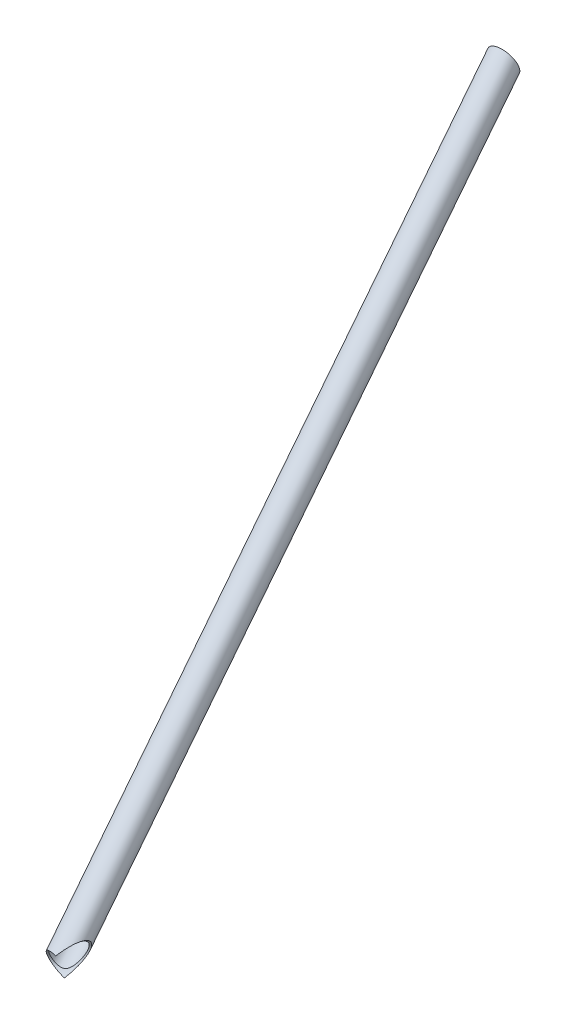
ISO-10303-21;
HEADER;
FILE_DESCRIPTION(('STEP AP214'),'2;1');
FILE_NAME('part.step','',(''),(''),'','','');
FILE_SCHEMA(('AUTOMOTIVE_DESIGN { 1 0 10303 214 1 1 1 1 }'));
ENDSEC;
DATA;
#1=APPLICATION_CONTEXT('core data for automotive mechanical design processes');
#2=APPLICATION_PROTOCOL_DEFINITION('international standard','automotive_design',2000,#1);
#3=PRODUCT_CONTEXT('',#1,'mechanical');
#4=PRODUCT('Part','Part','',(#3));
#5=PRODUCT_RELATED_PRODUCT_CATEGORY('part','',(#4));
#6=PRODUCT_DEFINITION_FORMATION('','',#4);
#7=PRODUCT_DEFINITION_CONTEXT('part definition',#1,'design');
#8=PRODUCT_DEFINITION('design','',#6,#7);
#9=PRODUCT_DEFINITION_SHAPE('','',#8);
#10=(LENGTH_UNIT() NAMED_UNIT(*) SI_UNIT(.MILLI.,.METRE.));
#11=(NAMED_UNIT(*) PLANE_ANGLE_UNIT() SI_UNIT($,.RADIAN.));
#12=(NAMED_UNIT(*) SI_UNIT($,.STERADIAN.) SOLID_ANGLE_UNIT());
#13=UNCERTAINTY_MEASURE_WITH_UNIT(LENGTH_MEASURE(1.E-05),#10,'distance_accuracy_value','');
#14=(GEOMETRIC_REPRESENTATION_CONTEXT(3) GLOBAL_UNCERTAINTY_ASSIGNED_CONTEXT((#13)) GLOBAL_UNIT_ASSIGNED_CONTEXT((#10,
#11,#12)) REPRESENTATION_CONTEXT('',''));
#15=CARTESIAN_POINT('',(0.,0.,0.));
#16=DIRECTION('',(0.,0.,1.));
#17=DIRECTION('',(1.,0.,0.));
#18=AXIS2_PLACEMENT_3D('',#15,#16,#17);
#19=CARTESIAN_POINT('',(79.9999999999999,380.,-601.037933611912));
#20=DIRECTION('',(0.313257210262409,-0.388871019636094,0.866400167535647));
#21=DIRECTION('',(0.,-0.912318699307092,-0.409480879766828));
#22=AXIS2_PLACEMENT_3D('',#19,#20,#21);
#23=CYLINDRICAL_SURFACE('',#22,7.1);
#24=CARTESIAN_POINT('',(80.,380.,-601.037933611912));
#25=DIRECTION('',(-0.0966021654991003,0.31145037677638,-0.945339454601751));
#26=DIRECTION('',(0.909209641489906,-0.358833563956318,-0.211131004829238));
#27=AXIS2_PLACEMENT_3D('',#24,#25,#26);
#28=ELLIPSE('',#27,7.31643769653913,7.1);
#29=CARTESIAN_POINT('',(86.6521756950536,377.374616585886,-602.582660454553));
#30=VERTEX_POINT('',#29);
#31=EDGE_CURVE('E82',#30,#30,#28,.T.);
#32=ORIENTED_EDGE('',*,*,#31,.T.);
#33=EDGE_LOOP('',(#32));
#34=FACE_BOUND('',#33,.T.);
#35=CARTESIAN_POINT('',(223.515440713806,195.365438417781,-207.013276925377));
#36=CARTESIAN_POINT('',(223.597773425152,195.416950629933,-207.128048578151));
#37=CARTESIAN_POINT('',(223.676056508917,195.47221110258,-207.244051635269));
#38=CARTESIAN_POINT('',(223.825780140405,195.588860752495,-207.477421559565));
#39=CARTESIAN_POINT('',(223.897216805009,195.650253367923,-207.594789158859));
#40=CARTESIAN_POINT('',(224.034504896229,195.778271012451,-207.830283092699));
#41=CARTESIAN_POINT('',(224.100345323369,195.844905872105,-207.948410452008));
#42=CARTESIAN_POINT('',(224.22728169512,195.982598498702,-208.184650416231));
#43=CARTESIAN_POINT('',(224.288376642596,196.053657189574,-208.302763012867));
#44=CARTESIAN_POINT('',(224.467137260118,196.274301660379,-208.65906509299));
#45=CARTESIAN_POINT('',(224.578781049185,196.4298985635,-208.896562976336));
#46=CARTESIAN_POINT('',(224.79093409521,196.754245504899,-209.366967014438));
#47=CARTESIAN_POINT('',(224.891454777749,196.922981737128,-209.599877675092));
#48=CARTESIAN_POINT('',(225.06480940219,197.236848420984,-210.012564997027));
#49=CARTESIAN_POINT('',(225.139095614411,197.379729850078,-210.193448782974));
#50=CARTESIAN_POINT('',(225.283745175549,197.673029683195,-210.550649303604));
#51=CARTESIAN_POINT('',(225.3541081552,197.823448794166,-210.726965607548));
#52=CARTESIAN_POINT('',(225.491760402449,198.131992748499,-211.074429289454));
#53=CARTESIAN_POINT('',(225.559045438188,198.290127617762,-211.245569447391));
#54=CARTESIAN_POINT('',(225.690976363679,198.614033738292,-211.581515366132));
#55=CARTESIAN_POINT('',(225.755622416451,198.779804516509,-211.746321518174));
#56=CARTESIAN_POINT('',(225.881997909568,199.117496850764,-212.066897463317));
#57=CARTESIAN_POINT('',(225.943750389981,199.289338324192,-212.222742339087));
#58=CARTESIAN_POINT('',(226.06526177578,199.641093567592,-212.525958646346));
#59=CARTESIAN_POINT('',(226.125020378111,199.821008555021,-212.673328792182));
#60=CARTESIAN_POINT('',(226.242510593629,200.188901441589,-212.957717123773));
#61=CARTESIAN_POINT('',(226.3002459662,200.376862767699,-213.094755120779));
#62=CARTESIAN_POINT('',(226.413758369691,200.761516662018,-213.356771074261));
#63=CARTESIAN_POINT('',(226.469536329192,200.958204987125,-213.481754799761));
#64=CARTESIAN_POINT('',(226.557647081556,201.282307499755,-213.671283406273));
#65=CARTESIAN_POINT('',(226.590650688434,201.406868566144,-213.740409768618));
#66=CARTESIAN_POINT('',(226.655786271521,201.659447477174,-213.872497238892));
#67=CARTESIAN_POINT('',(226.687918279625,201.787465194982,-213.935458572641));
#68=CARTESIAN_POINT('',(226.751250839715,202.047166097589,-214.054459964843));
#69=CARTESIAN_POINT('',(226.782450005487,202.1788542252,-214.110490076766));
#70=CARTESIAN_POINT('',(226.843706451881,202.445586339295,-214.214509512014));
#71=CARTESIAN_POINT('',(226.873763716358,202.580630373183,-214.262498721682));
#72=CARTESIAN_POINT('',(226.962585711203,202.993592670364,-214.393634051658));
#73=CARTESIAN_POINT('',(227.019375457916,203.27680374903,-214.462741069254));
#74=CARTESIAN_POINT('',(227.098653462181,203.708011236177,-214.529706629109));
#75=CARTESIAN_POINT('',(227.124082022848,203.852726655088,-214.54591386818));
#76=CARTESIAN_POINT('',(227.172609110419,204.143404872131,-214.56463082251));
#77=CARTESIAN_POINT('',(227.195708653635,204.28936709577,-214.567146537954));
#78=CARTESIAN_POINT('',(227.24889687908,204.646736704678,-214.554737273272));
#79=CARTESIAN_POINT('',(227.277482396619,204.858177240943,-214.531496637158));
#80=CARTESIAN_POINT('',(227.327491065809,205.275032047375,-214.450159815296));
#81=CARTESIAN_POINT('',(227.34892112294,205.480451952128,-214.392097387058));
#82=CARTESIAN_POINT('',(227.383710400963,205.879330714361,-214.240950757561));
#83=CARTESIAN_POINT('',(227.397050146395,206.072759710593,-214.147782914931));
#84=CARTESIAN_POINT('',(227.415329328028,206.441483594771,-213.930034013866));
#85=CARTESIAN_POINT('',(227.420262851938,206.616765638232,-213.805430916947));
#86=CARTESIAN_POINT('',(227.422422324272,206.980342991513,-213.502052214417));
#87=CARTESIAN_POINT('',(227.417823387257,207.163710821242,-213.317397665775));
#88=CARTESIAN_POINT('',(227.398763834638,207.498807699351,-212.921740550641));
#89=CARTESIAN_POINT('',(227.384284295637,207.650475305831,-212.710688061227));
#90=CARTESIAN_POINT('',(227.351720502178,207.891643694681,-212.32420784602));
#91=CARTESIAN_POINT('',(227.335336470855,207.987327381336,-212.152393459798));
#92=CARTESIAN_POINT('',(227.298563338807,208.163532462234,-211.801494660562));
#93=CARTESIAN_POINT('',(227.278172031724,208.244045455621,-211.622406285866));
#94=CARTESIAN_POINT('',(227.233902519773,208.391515461974,-211.259004768635));
#95=CARTESIAN_POINT('',(227.210020861034,208.458458888737,-211.074686598266));
#96=CARTESIAN_POINT('',(227.159180210831,208.580194102297,-210.702468482139));
#97=CARTESIAN_POINT('',(227.132220066987,208.634981315879,-210.514567217177));
#98=CARTESIAN_POINT('',(227.052798768595,208.773298969325,-209.984732984331));
#99=CARTESIAN_POINT('',(226.997220308897,208.844663346454,-209.640072551877));
#100=CARTESIAN_POINT('',(226.878046075809,208.958421077528,-208.947295664904));
#101=CARTESIAN_POINT('',(226.814443069541,209.000788070698,-208.599176356842));
#102=CARTESIAN_POINT('',(226.679056245101,209.061241271065,-207.900457204918));
#103=CARTESIAN_POINT('',(226.607228644535,209.079190295106,-207.549854380332));
#104=CARTESIAN_POINT('',(226.45519509458,209.093869054718,-206.850277561957));
#105=CARTESIAN_POINT('',(226.374994125147,209.090611332791,-206.501302727521));
#106=CARTESIAN_POINT('',(226.242532826423,209.071104884729,-205.960700604842));
#107=CARTESIAN_POINT('',(226.193668755641,209.061263222942,-205.767976214683));
#108=CARTESIAN_POINT('',(226.09247836653,209.036198748164,-205.383793102088));
#109=CARTESIAN_POINT('',(226.040152229581,209.020976216899,-205.192334313924));
#110=CARTESIAN_POINT('',(225.931399785372,208.985438220196,-204.810706300088));
#111=CARTESIAN_POINT('',(225.87496667648,208.965114163173,-204.620539811367));
#112=CARTESIAN_POINT('',(225.75733272852,208.919658139891,-204.242282948273));
#113=CARTESIAN_POINT('',(225.696132423073,208.894526711292,-204.054192344218));
#114=CARTESIAN_POINT('',(225.568421113201,208.839886741806,-203.682057641113));
#115=CARTESIAN_POINT('',(225.501953316297,208.810412393108,-203.497993786225));
#116=CARTESIAN_POINT('',(225.361945400646,208.747119470515,-203.133246002374));
#117=CARTESIAN_POINT('',(225.288403274455,208.713299662613,-202.95256305027));
#118=CARTESIAN_POINT('',(225.132675858372,208.641560866665,-202.596383188231));
#119=CARTESIAN_POINT('',(225.050515496554,208.603653692819,-202.420873104548));
#120=CARTESIAN_POINT('',(224.875075049934,208.523775075471,-202.076520974744));
#121=CARTESIAN_POINT('',(224.781803897748,208.481806901874,-201.907673715458));
#122=CARTESIAN_POINT('',(224.614316795881,208.408352948597,-201.633736978794));
#123=CARTESIAN_POINT('',(224.543968072732,208.377977589957,-201.525992897464));
#124=CARTESIAN_POINT('',(224.396004119807,208.315406426547,-201.316097321597));
#125=CARTESIAN_POINT('',(224.318388083991,208.28321042,-201.213946449418));
#126=CARTESIAN_POINT('',(224.155462195778,208.2171543778,-201.017353401906));
#127=CARTESIAN_POINT('',(224.070190034419,208.183302831239,-200.922877400054));
#128=CARTESIAN_POINT('',(223.891185808516,208.113796617265,-200.743025980732));
#129=CARTESIAN_POINT('',(223.797457072409,208.078142661674,-200.657647011353));
#130=CARTESIAN_POINT('',(223.621888542754,208.012550078573,-200.514355777762));
#131=CARTESIAN_POINT('',(223.541580590109,207.982948276772,-200.454409522029));
#132=CARTESIAN_POINT('',(223.376172865457,207.922566417539,-200.342226895417));
#133=CARTESIAN_POINT('',(223.291073935229,207.891786567393,-200.289989175944));
#134=CARTESIAN_POINT('',(223.116676877241,207.828953194481,-200.1936512376));
#135=CARTESIAN_POINT('',(223.027373331257,207.796898037031,-200.149561900306));
#136=CARTESIAN_POINT('',(222.845608133917,207.731475936385,-200.069738049813));
#137=CARTESIAN_POINT('',(222.75314704224,207.698109225507,-200.034002064691));
#138=CARTESIAN_POINT('',(222.545220812294,207.622361443563,-199.963605979065));
#139=CARTESIAN_POINT('',(222.429207366725,207.579624188296,-199.930947568825));
#140=CARTESIAN_POINT('',(222.195516746383,207.491728380155,-199.876802144946));
#141=CARTESIAN_POINT('',(222.077839110321,207.446569145858,-199.855318293644));
#142=CARTESIAN_POINT('',(221.841892257835,207.353422155931,-199.822235683462));
#143=CARTESIAN_POINT('',(221.723622298022,207.305427499917,-199.810662199353));
#144=CARTESIAN_POINT('',(221.487807079861,207.206415490708,-199.796198751575));
#145=CARTESIAN_POINT('',(221.370262081928,207.15539711406,-199.793311745372));
#146=CARTESIAN_POINT('',(221.079635496492,207.024335893896,-199.79544322266));
#147=CARTESIAN_POINT('',(220.907482326473,206.942292042074,-199.805013919788));
#148=CARTESIAN_POINT('',(220.56848776102,206.770216249307,-199.83744927756));
#149=CARTESIAN_POINT('',(220.401648786826,206.68018073601,-199.860319909026));
#150=CARTESIAN_POINT('',(220.074662172088,206.491614515532,-199.916842199558));
#151=CARTESIAN_POINT('',(219.914517139398,206.393080542449,-199.950498016914));
#152=CARTESIAN_POINT('',(219.602189408603,206.187266640093,-200.02663994002));
#153=CARTESIAN_POINT('',(219.450005593236,206.079987943474,-200.069124802535));
#154=CARTESIAN_POINT('',(219.150102433475,205.853110922616,-200.162829565661));
#155=CARTESIAN_POINT('',(219.002663937446,205.733235346653,-200.214277748869));
#156=CARTESIAN_POINT('',(218.718484001134,205.484089740377,-200.323607373711));
#157=CARTESIAN_POINT('',(218.581742946725,205.354819371501,-200.381489047229));
#158=CARTESIAN_POINT('',(218.320121554033,205.087160933632,-200.502540245333));
#159=CARTESIAN_POINT('',(218.195237248237,204.948775941018,-200.565707987685));
#160=CARTESIAN_POINT('',(217.958381333812,204.66327025621,-200.696358668694));
#161=CARTESIAN_POINT('',(217.846409194117,204.516149923669,-200.7638414297));
#162=CARTESIAN_POINT('',(217.631406420167,204.206524820721,-200.905538837196));
#163=CARTESIAN_POINT('',(217.529059379975,204.043620797029,-200.979921085499));
#164=CARTESIAN_POINT('',(217.340840999668,203.709766654423,-201.131473077034));
#165=CARTESIAN_POINT('',(217.254970403225,203.538816172761,-201.208642945898));
#166=CARTESIAN_POINT('',(217.100740633408,203.190032779126,-201.364828054797));
#167=CARTESIAN_POINT('',(217.03237817852,203.012201164072,-201.443842945989));
#168=CARTESIAN_POINT('',(216.91399049456,202.650960268944,-201.60284237808));
#169=CARTESIAN_POINT('',(216.863963724159,202.467551459103,-201.682826836891));
#170=CARTESIAN_POINT('',(216.785924124069,202.110668756077,-201.836877618748));
#171=CARTESIAN_POINT('',(216.756533975263,201.937490783179,-201.910934645653));
#172=CARTESIAN_POINT('',(216.714239232518,201.58892675918,-202.058546587804));
#173=CARTESIAN_POINT('',(216.701333769786,201.413540824936,-202.132101529308));
#174=CARTESIAN_POINT('',(216.692101327702,201.061928616794,-202.278140601165));
#175=CARTESIAN_POINT('',(216.695771416259,200.885702497026,-202.350624918628));
#176=CARTESIAN_POINT('',(216.719572969432,200.533739008541,-202.494054522715));
#177=CARTESIAN_POINT('',(216.739704367612,200.358001637854,-202.56499981555));
#178=CARTESIAN_POINT('',(216.795235518671,200.013868527634,-202.702756021031));
#179=CARTESIAN_POINT('',(216.830135350042,199.845415675622,-202.769626791335));
#180=CARTESIAN_POINT('',(216.914676922683,199.51135264398,-202.901320559658));
#181=CARTESIAN_POINT('',(216.964324888235,199.345743695866,-202.966142680263));
#182=CARTESIAN_POINT('',(217.077782246081,199.018619485886,-203.0935307727));
#183=CARTESIAN_POINT('',(217.141588069037,198.857103203633,-203.156097308573));
#184=CARTESIAN_POINT('',(217.282678778075,198.539249552152,-203.278920121075));
#185=CARTESIAN_POINT('',(217.359958765874,198.382910325393,-203.339177227577));
#186=CARTESIAN_POINT('',(217.530835211728,198.069835024545,-203.459996156841));
#187=CARTESIAN_POINT('',(217.624985345671,197.91336422479,-203.52046218308));
#188=CARTESIAN_POINT('',(217.826261987491,197.608145463378,-203.639241639389));
#189=CARTESIAN_POINT('',(217.933389007691,197.459397806961,-203.697554984354));
#190=CARTESIAN_POINT('',(218.159901195315,197.170394392857,-203.812577079494));
#191=CARTESIAN_POINT('',(218.279309076348,197.030155161501,-203.869282599708));
#192=CARTESIAN_POINT('',(218.529247234812,196.759528430897,-203.981651022158));
#193=CARTESIAN_POINT('',(218.659777360301,196.629140797111,-204.037313938624));
#194=CARTESIAN_POINT('',(218.941818492512,196.369335228384,-204.153020499252));
#195=CARTESIAN_POINT('',(219.094172568881,196.240827692893,-204.213058702332));
#196=CARTESIAN_POINT('',(219.409412996459,195.998158386196,-204.334808452989));
#197=CARTESIAN_POINT('',(219.572303743213,195.884002661306,-204.396520692603));
#198=CARTESIAN_POINT('',(219.906548301658,195.672377183837,-204.523878432159));
#199=CARTESIAN_POINT('',(220.077878664191,195.574864225283,-204.589513131257));
#200=CARTESIAN_POINT('',(220.427039222931,195.398846591872,-204.72806705648));
#201=CARTESIAN_POINT('',(220.604862218604,195.320321554148,-204.800978359436));
#202=CARTESIAN_POINT('',(220.976858669584,195.180692783628,-204.964045903185));
#203=CARTESIAN_POINT('',(221.171298411601,195.121215977905,-205.055057578592));
#204=CARTESIAN_POINT('',(221.460624383678,195.054643294172,-205.205343270347));
#205=CARTESIAN_POINT('',(221.556580580557,195.036233443368,-205.257672725931));
#206=CARTESIAN_POINT('',(221.746778341795,195.007331824858,-205.367450502931));
#207=CARTESIAN_POINT('',(221.841019970859,194.996839757733,-205.424898630688));
#208=CARTESIAN_POINT('',(222.02739862248,194.983977418794,-205.545625132932));
#209=CARTESIAN_POINT('',(222.119511642244,194.981675376188,-205.608947996999));
#210=CARTESIAN_POINT('',(222.299703292016,194.985317590288,-205.740879835085));
#211=CARTESIAN_POINT('',(222.387781894382,194.991261903488,-205.809488845314));
#212=CARTESIAN_POINT('',(222.559141701557,195.01099904115,-205.951592661741));
#213=CARTESIAN_POINT('',(222.642417154916,195.024801068301,-206.025093107328));
#214=CARTESIAN_POINT('',(222.8035614726,195.05955961672,-206.176161583616));
#215=CARTESIAN_POINT('',(222.881430513237,195.080515904545,-206.253729481524));
#216=CARTESIAN_POINT('',(223.059638299798,195.137716088856,-206.441605999042));
#217=CARTESIAN_POINT('',(223.157564104535,195.176746996176,-206.55336293819));
#218=CARTESIAN_POINT('',(223.2970631007,195.242487771826,-206.723938038999));
#219=CARTESIAN_POINT('',(223.342303347885,195.265582582758,-206.781247035248));
#220=CARTESIAN_POINT('',(223.430526135985,195.313940291728,-206.896689849229));
#221=CARTESIAN_POINT('',(223.473508634963,195.339203230017,-206.954823682257));
#222=CARTESIAN_POINT('',(223.515440713806,195.365438417781,-207.013276925377));
#223=B_SPLINE_CURVE_WITH_KNOTS('',3,(#35,#36,#37,#38,#39,#40,#41,#42,#43,#44,#45,#46,#47,#48,
#49,#50,#51,#52,#53,#54,#55,#56,#57,#58,#59,#60,#61,#62,#63,#64,#65,#66,#67,#68,#69,#70,#71,#72,
#73,#74,#75,#76,#77,#78,#79,#80,#81,#82,#83,#84,#85,#86,#87,#88,#89,#90,#91,#92,#93,#94,#95,#96,
#97,#98,#99,#100,#101,#102,#103,#104,#105,#106,#107,#108,#109,#110,#111,#112,#113,#114,#115,
#116,#117,#118,#119,#120,#121,#122,#123,#124,#125,#126,#127,#128,#129,#130,#131,#132,#133,#134,
#135,#136,#137,#138,#139,#140,#141,#142,#143,#144,#145,#146,#147,#148,#149,#150,#151,#152,#153,
#154,#155,#156,#157,#158,#159,#160,#161,#162,#163,#164,#165,#166,#167,#168,#169,#170,#171,#172,
#173,#174,#175,#176,#177,#178,#179,#180,#181,#182,#183,#184,#185,#186,#187,#188,#189,#190,#191,
#192,#193,#194,#195,#196,#197,#198,#199,#200,#201,#202,#203,#204,#205,#206,#207,#208,#209,#210,
#211,#212,#213,#214,#215,#216,#217,#218,#219,#220,#221,#222),.UNSPECIFIED.,.T.,.F.,(4,2,2,2,2,2,
2,2,2,2,2,2,2,2,2,2,2,2,2,2,2,2,2,2,2,2,2,2,2,2,2,2,2,2,2,2,2,2,2,2,2,2,2,2,2,2,2,2,2,2,2,2,2,2,
2,2,2,2,2,2,2,2,2,2,2,2,2,2,2,2,2,2,2,2,2,2,2,2,2,2,2,2,2,2,2,2,2,2,2,2,2,2,2,4),(0.,
0.450995453443129,0.902245205020399,1.3543623168352,1.80657417331596,2.72110845527667,
3.63469443827829,4.36105409366616,5.0874820011711,5.81488036909943,6.54223373462262,
7.26216062830249,7.98219645153389,8.70081455441166,9.41908701108281,9.85762860559192,
10.2961541305271,10.7353018283336,11.1744557329934,12.0613448096937,12.5042772137361,
12.9470154910599,13.5880400493527,14.2284441774211,14.8703838663352,15.5127748601422,
16.2893269942449,17.0673705760151,17.6586048366835,18.2501655405433,18.8423156362168,
19.4346881247997,20.5019306660215,21.5701421258894,22.6443304835213,23.717883581641,
24.3149924053198,24.912069970805,25.5101599141815,26.1081830058296,26.7017271884883,
27.2954402976645,27.8874811340395,28.479049166255,28.8754245953936,29.2718440400167,
29.6664089949755,30.0608193243227,30.3739296417648,30.6869851160364,31.0004556792825,
31.313870964953,31.6968946199389,32.0800266095507,32.4641328289799,32.8483698093949,
33.4203584646502,33.9926041047461,34.5650706433793,35.1374566263784,35.7274296688336,
36.3174239827959,36.9072201715187,37.4969920938448,38.1149656703905,38.732967132908,
39.3508526797662,39.9686862741542,40.5398549852242,41.1109935927361,41.6820311741176,
42.2530664509081,42.8061488938438,43.3594650913294,43.9126419504486,44.4656181300767,
45.0420851839143,45.6185750039503,46.1961509065207,46.7737189199702,47.3974485096177,
48.0214399977023,48.6437860636888,49.2654617288088,49.9311494376021,50.2633152169037,
50.5954684344552,50.9303823476148,51.2652985551602,51.6006078144491,51.9359061335973,
52.395896108243,52.6255839863296,52.8552761293703),.UNSPECIFIED.);
#224=CARTESIAN_POINT('',(223.515440713806,195.365438417781,-207.013276925377));
#225=VERTEX_POINT('',#224);
#226=EDGE_CURVE('E46',#225,#225,#223,.T.);
#227=ORIENTED_EDGE('',*,*,#226,.T.);
#228=EDGE_LOOP('',(#227));
#229=FACE_BOUND('',#228,.T.);
#230=ADVANCED_FACE('F41',(#34,#229),#23,.F.);
#231=CARTESIAN_POINT('',(79.9999999999999,380.,-601.037933611912));
#232=DIRECTION('',(0.313257210262409,-0.388871019636094,0.866400167535647));
#233=DIRECTION('',(0.,-0.912318699307092,-0.409480879766828));
#234=AXIS2_PLACEMENT_3D('',#231,#232,#233);
#235=CYLINDRICAL_SURFACE('',#234,8.);
#236=CARTESIAN_POINT('',(80.,380.,-601.037933611912));
#237=DIRECTION('',(-0.0966021654991003,0.31145037677638,-0.945339454601751));
#238=DIRECTION('',(0.909209641489906,-0.358833563956318,-0.211131004829238));
#239=AXIS2_PLACEMENT_3D('',#236,#237,#238);
#240=ELLIPSE('',#239,8.24387346088917,8.);
#241=CARTESIAN_POINT('',(87.4954092338632,377.041821505224,-602.778470899395));
#242=VERTEX_POINT('',#241);
#243=EDGE_CURVE('E63',#242,#242,#240,.T.);
#244=ORIENTED_EDGE('',*,*,#243,.F.);
#245=EDGE_LOOP('',(#244));
#246=FACE_BOUND('',#245,.T.);
#247=CARTESIAN_POINT('',(225.,200.,-200.));
#248=DIRECTION('',(0.979997411230481,-0.1383871597552,0.143017719169493));
#249=DIRECTION('',(-0.18494238420669,-0.367901037751926,0.911287627999525));
#250=AXIS2_PLACEMENT_3D('',#247,#248,#249);
#251=ELLIPSE('',#250,16.5044898743675,8.);
#252=CARTESIAN_POINT('',(224.412046885924,192.643923565657,-203.089085726837));
#253=VERTEX_POINT('',#252);
#254=CARTESIAN_POINT('',(225.587953114076,207.356076434343,-196.910914273163));
#255=VERTEX_POINT('',#254);
#256=EDGE_CURVE('E56',#253,#255,#251,.T.);
#257=ORIENTED_EDGE('',*,*,#256,.F.);
#258=CARTESIAN_POINT('',(225.,200.,-200.));
#259=DIRECTION('',(-0.18494238420669,-0.367901037751926,0.911287627999525));
#260=DIRECTION('',(0.979997411230481,-0.1383871597552,0.143017719169493));
#261=AXIS2_PLACEMENT_3D('',#258,#259,#260);
#262=ELLIPSE('',#261,9.14629332778499,8.);
#263=EDGE_CURVE('E11',#255,#253,#262,.T.);
#264=ORIENTED_EDGE('',*,*,#263,.F.);
#265=EDGE_LOOP('',(#257,#264));
#266=FACE_BOUND('',#265,.T.);
#267=ADVANCED_FACE('F65',(#246,#266),#235,.T.);
#268=CARTESIAN_POINT('',(80.,380.,-601.037933611912));
#269=DIRECTION('',(-0.0966021654991003,0.31145037677638,-0.945339454601751));
#270=DIRECTION('',(0.,0.949781512459289,0.312913851707695));
#271=AXIS2_PLACEMENT_3D('',#268,#269,#270);
#272=PLANE('',#271);
#273=ORIENTED_EDGE('',*,*,#31,.F.);
#274=EDGE_LOOP('',(#273));
#275=FACE_BOUND('',#274,.T.);
#276=ORIENTED_EDGE('',*,*,#243,.T.);
#277=EDGE_LOOP('',(#276));
#278=FACE_BOUND('',#277,.T.);
#279=ADVANCED_FACE('F67',(#275,#278),#272,.T.);
#280=CARTESIAN_POINT('',(50.0000000000001,130.,0.));
#281=DIRECTION('',(0.636784790371593,0.254713916148637,-0.727754046138963));
#282=DIRECTION('',(-0.752576694706878,0.,-0.658504607868518));
#283=AXIS2_PLACEMENT_3D('',#280,#281,#282);
#284=CYLINDRICAL_SURFACE('',#283,8.);
#285=ORIENTED_EDGE('',*,*,#226,.F.);
#286=EDGE_LOOP('',(#285));
#287=FACE_BOUND('',#286,.T.);
#288=ORIENTED_EDGE('',*,*,#256,.T.);
#289=ORIENTED_EDGE('',*,*,#263,.T.);
#290=EDGE_LOOP('',(#288,#289));
#291=FACE_BOUND('',#290,.T.);
#292=ADVANCED_FACE('F43',(#287,#291),#284,.F.);
#293=CLOSED_SHELL('',(#230,#267,#279,#292));
#294=MANIFOLD_SOLID_BREP('B2',#293);
#295=ADVANCED_BREP_SHAPE_REPRESENTATION('',(#18,#294),#14);
#296=SHAPE_DEFINITION_REPRESENTATION(#9,#295);
ENDSEC;
END-ISO-10303-21;
